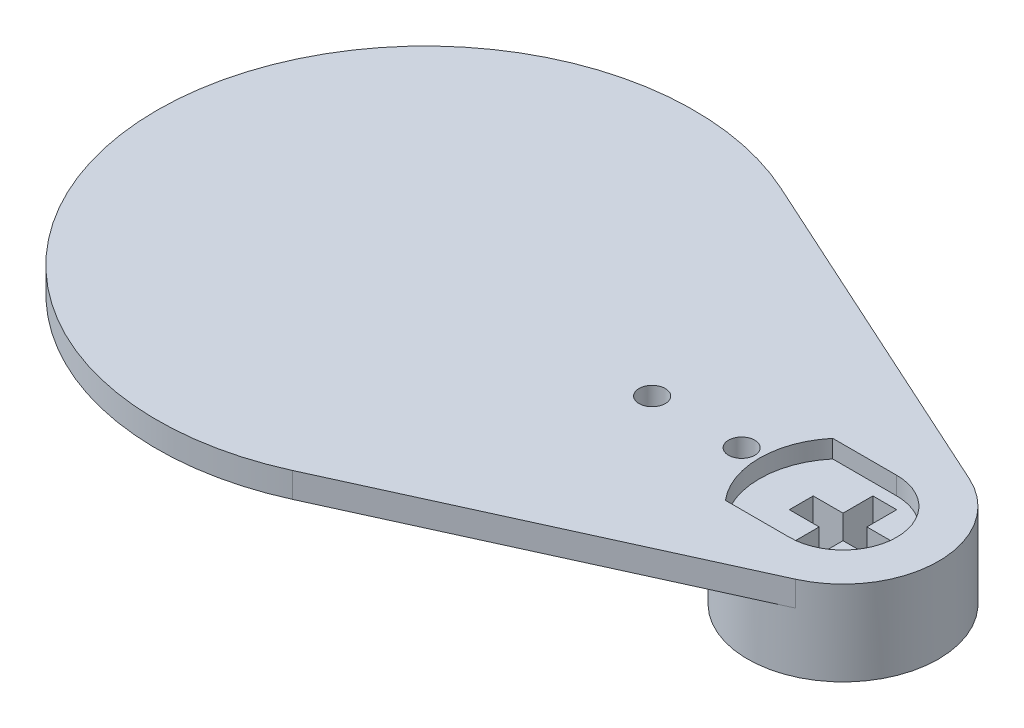
ISO-10303-21;
HEADER;
FILE_DESCRIPTION(('STEP AP214'),'2;1');
FILE_NAME('part.step','',(''),(''),'','','');
FILE_SCHEMA(('AUTOMOTIVE_DESIGN { 1 0 10303 214 1 1 1 1 }'));
ENDSEC;
DATA;
#1=APPLICATION_CONTEXT('core data for automotive mechanical design processes');
#2=APPLICATION_PROTOCOL_DEFINITION('international standard','automotive_design',2000,#1);
#3=PRODUCT_CONTEXT('',#1,'mechanical');
#4=PRODUCT('Part','Part','',(#3));
#5=PRODUCT_RELATED_PRODUCT_CATEGORY('part','',(#4));
#6=PRODUCT_DEFINITION_FORMATION('','',#4);
#7=PRODUCT_DEFINITION_CONTEXT('part definition',#1,'design');
#8=PRODUCT_DEFINITION('design','',#6,#7);
#9=PRODUCT_DEFINITION_SHAPE('','',#8);
#10=(LENGTH_UNIT() NAMED_UNIT(*) SI_UNIT(.MILLI.,.METRE.));
#11=(NAMED_UNIT(*) PLANE_ANGLE_UNIT() SI_UNIT($,.RADIAN.));
#12=(NAMED_UNIT(*) SI_UNIT($,.STERADIAN.) SOLID_ANGLE_UNIT());
#13=UNCERTAINTY_MEASURE_WITH_UNIT(LENGTH_MEASURE(1.E-05),#10,'distance_accuracy_value','');
#14=(GEOMETRIC_REPRESENTATION_CONTEXT(3) GLOBAL_UNCERTAINTY_ASSIGNED_CONTEXT((#13)) GLOBAL_UNIT_ASSIGNED_CONTEXT((#10,
#11,#12)) REPRESENTATION_CONTEXT('',''));
#15=CARTESIAN_POINT('',(0.,0.,0.));
#16=DIRECTION('',(0.,0.,1.));
#17=DIRECTION('',(1.,0.,0.));
#18=AXIS2_PLACEMENT_3D('',#15,#16,#17);
#19=CARTESIAN_POINT('',(-35.,2.1,0.));
#20=DIRECTION('',(0.,1.,0.));
#21=DIRECTION('',(0.,0.,1.));
#22=AXIS2_PLACEMENT_3D('',#19,#20,#21);
#23=PLANE('',#22);
#24=CARTESIAN_POINT('',(-8.5,2.1,0.));
#25=DIRECTION('',(0.,1.,0.));
#26=DIRECTION('',(0.,0.,1.));
#27=AXIS2_PLACEMENT_3D('',#24,#25,#26);
#28=CIRCLE('',#27,1.1);
#29=CARTESIAN_POINT('',(-8.5,2.1,1.1));
#30=VERTEX_POINT('',#29);
#31=EDGE_CURVE('E292',#30,#30,#28,.T.);
#32=ORIENTED_EDGE('',*,*,#31,.F.);
#33=EDGE_LOOP('',(#32));
#34=FACE_BOUND('',#33,.T.);
#35=CARTESIAN_POINT('',(-16.,2.1,0.));
#36=DIRECTION('',(0.,1.,0.));
#37=DIRECTION('',(0.,0.,1.));
#38=AXIS2_PLACEMENT_3D('',#35,#36,#37);
#39=CIRCLE('',#38,1.1);
#40=CARTESIAN_POINT('',(-16.,2.1,1.1));
#41=VERTEX_POINT('',#40);
#42=EDGE_CURVE('E197',#41,#41,#39,.T.);
#43=ORIENTED_EDGE('',*,*,#42,.F.);
#44=EDGE_LOOP('',(#43));
#45=FACE_BOUND('',#44,.T.);
#46=CARTESIAN_POINT('',(0.,2.1,0.));
#47=DIRECTION('',(0.,1.,0.));
#48=DIRECTION('',(0.,0.,1.));
#49=AXIS2_PLACEMENT_3D('',#46,#47,#48);
#50=CIRCLE('',#49,7.);
#51=CARTESIAN_POINT('',(-5.3619026473818,2.1,-4.5));
#52=VERTEX_POINT('',#51);
#53=CARTESIAN_POINT('',(-5.3619026473818,2.1,4.5));
#54=VERTEX_POINT('',#53);
#55=EDGE_CURVE('E207',#52,#54,#50,.T.);
#56=ORIENTED_EDGE('',*,*,#55,.F.);
#57=DIRECTION('',(-1.,0.,0.));
#58=VECTOR('',#57,1.);
#59=CARTESIAN_POINT('',(-5.3619026473818,2.1,-4.5));
#60=LINE('',#59,#58);
#61=CARTESIAN_POINT('',(0.,2.1,-4.5));
#62=VERTEX_POINT('',#61);
#63=EDGE_CURVE('E220',#62,#52,#60,.T.);
#64=ORIENTED_EDGE('',*,*,#63,.F.);
#65=CARTESIAN_POINT('',(0.,2.1,0.));
#66=DIRECTION('',(0.,1.,0.));
#67=DIRECTION('',(0.,0.,1.));
#68=AXIS2_PLACEMENT_3D('',#65,#66,#67);
#69=CIRCLE('',#68,4.5);
#70=CARTESIAN_POINT('',(0.,2.1,4.5));
#71=VERTEX_POINT('',#70);
#72=EDGE_CURVE('E232',#71,#62,#69,.T.);
#73=ORIENTED_EDGE('',*,*,#72,.F.);
#74=DIRECTION('',(1.,0.,0.));
#75=VECTOR('',#74,1.);
#76=CARTESIAN_POINT('',(-5.3619026473818,2.1,4.5));
#77=LINE('',#76,#75);
#78=EDGE_CURVE('E210',#54,#71,#77,.T.);
#79=ORIENTED_EDGE('',*,*,#78,.F.);
#80=EDGE_LOOP('',(#56,#64,#73,#79));
#81=FACE_BOUND('',#80,.T.);
#82=CARTESIAN_POINT('',(-35.,2.1,0.));
#83=DIRECTION('',(0.,1.,0.));
#84=DIRECTION('',(0.,0.,1.));
#85=AXIS2_PLACEMENT_3D('',#82,#83,#84);
#86=CIRCLE('',#85,22.5);
#87=CARTESIAN_POINT('',(-25.6785714285714,2.1,-20.4783048465383));
#88=VERTEX_POINT('',#87);
#89=CARTESIAN_POINT('',(-25.6785714285714,2.1,20.4783048465383));
#90=VERTEX_POINT('',#89);
#91=EDGE_CURVE('E246',#88,#90,#86,.T.);
#92=ORIENTED_EDGE('',*,*,#91,.T.);
#93=DIRECTION('',(0.91014688206837,0.,-0.414285714285714));
#94=VECTOR('',#93,1.);
#95=CARTESIAN_POINT('',(-25.6785714285714,2.1,20.4783048465383));
#96=LINE('',#95,#94);
#97=CARTESIAN_POINT('',(3.31428571428571,2.1,7.28117505654696));
#98=VERTEX_POINT('',#97);
#99=EDGE_CURVE('E249',#90,#98,#96,.T.);
#100=ORIENTED_EDGE('',*,*,#99,.T.);
#101=CARTESIAN_POINT('',(0.,2.1,0.));
#102=DIRECTION('',(0.,1.,0.));
#103=DIRECTION('',(0.,0.,1.));
#104=AXIS2_PLACEMENT_3D('',#101,#102,#103);
#105=CIRCLE('',#104,8.);
#106=CARTESIAN_POINT('',(3.31428571428571,2.1,-7.28117505654696));
#107=VERTEX_POINT('',#106);
#108=EDGE_CURVE('E252',#98,#107,#105,.T.);
#109=ORIENTED_EDGE('',*,*,#108,.T.);
#110=DIRECTION('',(-0.91014688206837,0.,-0.414285714285714));
#111=VECTOR('',#110,1.);
#112=CARTESIAN_POINT('',(-25.6785714285714,2.1,-20.4783048465383));
#113=LINE('',#112,#111);
#114=EDGE_CURVE('E254',#107,#88,#113,.T.);
#115=ORIENTED_EDGE('',*,*,#114,.T.);
#116=EDGE_LOOP('',(#92,#100,#109,#115));
#117=FACE_BOUND('',#116,.T.);
#118=ADVANCED_FACE('F36',(#34,#45,#81,#117),#23,.T.);
#119=CARTESIAN_POINT('',(-35.,0.,0.));
#120=DIRECTION('',(0.,1.,0.));
#121=DIRECTION('',(0.,0.,1.));
#122=AXIS2_PLACEMENT_3D('',#119,#120,#121);
#123=PLANE('',#122);
#124=CARTESIAN_POINT('',(-16.,0.,0.));
#125=DIRECTION('',(0.,1.,0.));
#126=DIRECTION('',(0.,0.,1.));
#127=AXIS2_PLACEMENT_3D('',#124,#125,#126);
#128=CIRCLE('',#127,1.1);
#129=CARTESIAN_POINT('',(-16.,0.,1.1));
#130=VERTEX_POINT('',#129);
#131=EDGE_CURVE('E40',#130,#130,#128,.T.);
#132=ORIENTED_EDGE('',*,*,#131,.T.);
#133=EDGE_LOOP('',(#132));
#134=FACE_BOUND('',#133,.T.);
#135=CARTESIAN_POINT('',(0.,0.,0.));
#136=DIRECTION('',(0.,-1.,0.));
#137=DIRECTION('',(0.,0.,-1.));
#138=AXIS2_PLACEMENT_3D('',#135,#136,#137);
#139=CIRCLE('',#138,8.);
#140=CARTESIAN_POINT('',(-7.64705882352941,0.,-2.34999815946331));
#141=VERTEX_POINT('',#140);
#142=CARTESIAN_POINT('',(3.31428571428571,0.,-7.28117505654696));
#143=VERTEX_POINT('',#142);
#144=EDGE_CURVE('E45',#141,#143,#139,.T.);
#145=ORIENTED_EDGE('',*,*,#144,.F.);
#146=CARTESIAN_POINT('',(-8.5,0.,0.));
#147=DIRECTION('',(0.,1.,0.));
#148=DIRECTION('',(0.,0.,1.));
#149=AXIS2_PLACEMENT_3D('',#146,#147,#148);
#150=CIRCLE('',#149,2.5);
#151=CARTESIAN_POINT('',(-7.64705882352941,0.,2.34999815946331));
#152=VERTEX_POINT('',#151);
#153=EDGE_CURVE('E193',#141,#152,#150,.F.);
#154=ORIENTED_EDGE('',*,*,#153,.T.);
#155=CARTESIAN_POINT('',(3.31428571428571,0.,7.28117505654696));
#156=VERTEX_POINT('',#155);
#157=EDGE_CURVE('E11',#156,#152,#139,.T.);
#158=ORIENTED_EDGE('',*,*,#157,.F.);
#159=DIRECTION('',(0.91014688206837,0.,-0.414285714285714));
#160=VECTOR('',#159,1.);
#161=CARTESIAN_POINT('',(-25.6785714285714,0.,20.4783048465383));
#162=LINE('',#161,#160);
#163=CARTESIAN_POINT('',(-25.6785714285714,0.,20.4783048465383));
#164=VERTEX_POINT('',#163);
#165=EDGE_CURVE('E259',#164,#156,#162,.T.);
#166=ORIENTED_EDGE('',*,*,#165,.F.);
#167=CARTESIAN_POINT('',(-35.,0.,0.));
#168=DIRECTION('',(0.,1.,0.));
#169=DIRECTION('',(0.,0.,1.));
#170=AXIS2_PLACEMENT_3D('',#167,#168,#169);
#171=CIRCLE('',#170,22.5);
#172=CARTESIAN_POINT('',(-25.6785714285714,0.,-20.4783048465383));
#173=VERTEX_POINT('',#172);
#174=EDGE_CURVE('E239',#173,#164,#171,.T.);
#175=ORIENTED_EDGE('',*,*,#174,.F.);
#176=DIRECTION('',(-0.91014688206837,0.,-0.414285714285714));
#177=VECTOR('',#176,1.);
#178=CARTESIAN_POINT('',(-25.6785714285714,0.,-20.4783048465383));
#179=LINE('',#178,#177);
#180=EDGE_CURVE('E250',#143,#173,#179,.T.);
#181=ORIENTED_EDGE('',*,*,#180,.F.);
#182=EDGE_LOOP('',(#145,#154,#158,#166,#175,#181));
#183=FACE_BOUND('',#182,.T.);
#184=CARTESIAN_POINT('',(-8.5,0.,0.));
#185=DIRECTION('',(0.,1.,0.));
#186=DIRECTION('',(0.,0.,1.));
#187=AXIS2_PLACEMENT_3D('',#184,#185,#186);
#188=CIRCLE('',#187,1.1);
#189=CARTESIAN_POINT('',(-8.5,0.,1.1));
#190=VERTEX_POINT('',#189);
#191=EDGE_CURVE('E295',#190,#190,#188,.T.);
#192=ORIENTED_EDGE('',*,*,#191,.T.);
#193=EDGE_LOOP('',(#192));
#194=FACE_BOUND('',#193,.T.);
#195=ADVANCED_FACE('F280',(#134,#183,#194),#123,.F.);
#196=CARTESIAN_POINT('',(-35.,2.1,0.));
#197=DIRECTION('',(0.,-1.,0.));
#198=DIRECTION('',(0.,0.,-1.));
#199=AXIS2_PLACEMENT_3D('',#196,#197,#198);
#200=CYLINDRICAL_SURFACE('',#199,22.5);
#201=ORIENTED_EDGE('',*,*,#174,.T.);
#202=DIRECTION('',(0.,-1.,0.));
#203=VECTOR('',#202,1.);
#204=CARTESIAN_POINT('',(-25.6785714285714,2.1,20.4783048465383));
#205=LINE('',#204,#203);
#206=EDGE_CURVE('E270',#90,#164,#205,.T.);
#207=ORIENTED_EDGE('',*,*,#206,.F.);
#208=ORIENTED_EDGE('',*,*,#91,.F.);
#209=DIRECTION('',(0.,-1.,0.));
#210=VECTOR('',#209,1.);
#211=CARTESIAN_POINT('',(-25.6785714285714,2.1,-20.4783048465383));
#212=LINE('',#211,#210);
#213=EDGE_CURVE('E256',#88,#173,#212,.T.);
#214=ORIENTED_EDGE('',*,*,#213,.T.);
#215=EDGE_LOOP('',(#201,#207,#208,#214));
#216=FACE_BOUND('',#215,.T.);
#217=ADVANCED_FACE('F38',(#216),#200,.T.);
#218=CARTESIAN_POINT('',(-25.6785714285714,2.1,20.4783048465383));
#219=DIRECTION('',(-0.414285714285714,0.,-0.91014688206837));
#220=DIRECTION('',(-0.91014688206837,0.,0.414285714285714));
#221=AXIS2_PLACEMENT_3D('',#218,#219,#220);
#222=PLANE('',#221);
#223=ORIENTED_EDGE('',*,*,#165,.T.);
#224=DIRECTION('',(0.,-1.,0.));
#225=VECTOR('',#224,1.);
#226=CARTESIAN_POINT('',(3.31428571428571,2.1,7.28117505654696));
#227=LINE('',#226,#225);
#228=EDGE_CURVE('E268',#98,#156,#227,.T.);
#229=ORIENTED_EDGE('',*,*,#228,.F.);
#230=ORIENTED_EDGE('',*,*,#99,.F.);
#231=ORIENTED_EDGE('',*,*,#206,.T.);
#232=EDGE_LOOP('',(#223,#229,#230,#231));
#233=FACE_BOUND('',#232,.T.);
#234=ADVANCED_FACE('F288',(#233),#222,.F.);
#235=CARTESIAN_POINT('',(0.,2.1,0.));
#236=DIRECTION('',(0.,-1.,0.));
#237=DIRECTION('',(0.,0.,-1.));
#238=AXIS2_PLACEMENT_3D('',#235,#236,#237);
#239=CYLINDRICAL_SURFACE('',#238,8.);
#240=CARTESIAN_POINT('',(0.,-5.,0.));
#241=DIRECTION('',(0.,-1.,0.));
#242=DIRECTION('',(0.,0.,-1.));
#243=AXIS2_PLACEMENT_3D('',#240,#241,#242);
#244=CIRCLE('',#243,8.);
#245=CARTESIAN_POINT('',(-7.64705882352941,-5.,-2.34999815946331));
#246=VERTEX_POINT('',#245);
#247=CARTESIAN_POINT('',(-7.64705882352941,-5.,2.34999815946331));
#248=VERTEX_POINT('',#247);
#249=EDGE_CURVE('E204',#246,#248,#244,.T.);
#250=ORIENTED_EDGE('',*,*,#249,.F.);
#251=DIRECTION('',(0.,-1.,0.));
#252=VECTOR('',#251,1.);
#253=CARTESIAN_POINT('',(-7.64705882352941,-2.5,-2.34999815946331));
#254=LINE('',#253,#252);
#255=EDGE_CURVE('E187',#246,#141,#254,.F.);
#256=ORIENTED_EDGE('',*,*,#255,.T.);
#257=ORIENTED_EDGE('',*,*,#144,.T.);
#258=DIRECTION('',(0.,-1.,0.));
#259=VECTOR('',#258,1.);
#260=CARTESIAN_POINT('',(3.31428571428571,2.1,-7.28117505654696));
#261=LINE('',#260,#259);
#262=EDGE_CURVE('E265',#107,#143,#261,.T.);
#263=ORIENTED_EDGE('',*,*,#262,.F.);
#264=ORIENTED_EDGE('',*,*,#108,.F.);
#265=ORIENTED_EDGE('',*,*,#228,.T.);
#266=ORIENTED_EDGE('',*,*,#157,.T.);
#267=DIRECTION('',(0.,-1.,0.));
#268=VECTOR('',#267,1.);
#269=CARTESIAN_POINT('',(-7.64705882352941,-2.5,2.34999815946331));
#270=LINE('',#269,#268);
#271=EDGE_CURVE('E198',#152,#248,#270,.T.);
#272=ORIENTED_EDGE('',*,*,#271,.T.);
#273=EDGE_LOOP('',(#250,#256,#257,#263,#264,#265,#266,#272));
#274=FACE_BOUND('',#273,.T.);
#275=ADVANCED_FACE('F206',(#274),#239,.T.);
#276=CARTESIAN_POINT('',(-25.6785714285714,2.1,-20.4783048465383));
#277=DIRECTION('',(-0.414285714285714,0.,0.91014688206837));
#278=DIRECTION('',(0.91014688206837,0.,0.414285714285714));
#279=AXIS2_PLACEMENT_3D('',#276,#277,#278);
#280=PLANE('',#279);
#281=ORIENTED_EDGE('',*,*,#180,.T.);
#282=ORIENTED_EDGE('',*,*,#213,.F.);
#283=ORIENTED_EDGE('',*,*,#114,.F.);
#284=ORIENTED_EDGE('',*,*,#262,.T.);
#285=EDGE_LOOP('',(#281,#282,#283,#284));
#286=FACE_BOUND('',#285,.T.);
#287=ADVANCED_FACE('F284',(#286),#280,.F.);
#288=CARTESIAN_POINT('',(0.,0.6,0.));
#289=DIRECTION('',(0.,1.,0.));
#290=DIRECTION('',(0.,0.,1.));
#291=AXIS2_PLACEMENT_3D('',#288,#289,#290);
#292=CYLINDRICAL_SURFACE('',#291,7.);
#293=ORIENTED_EDGE('',*,*,#55,.T.);
#294=DIRECTION('',(0.,1.,0.));
#295=VECTOR('',#294,1.);
#296=CARTESIAN_POINT('',(-5.3619026473818,0.6,4.5));
#297=LINE('',#296,#295);
#298=CARTESIAN_POINT('',(-5.3619026473818,0.6,4.5));
#299=VERTEX_POINT('',#298);
#300=EDGE_CURVE('E228',#299,#54,#297,.T.);
#301=ORIENTED_EDGE('',*,*,#300,.F.);
#302=CARTESIAN_POINT('',(0.,0.6,0.));
#303=DIRECTION('',(0.,1.,0.));
#304=DIRECTION('',(0.,0.,1.));
#305=AXIS2_PLACEMENT_3D('',#302,#303,#304);
#306=CIRCLE('',#305,7.);
#307=CARTESIAN_POINT('',(-5.3619026473818,0.6,-4.5));
#308=VERTEX_POINT('',#307);
#309=EDGE_CURVE('E216',#308,#299,#306,.T.);
#310=ORIENTED_EDGE('',*,*,#309,.F.);
#311=DIRECTION('',(0.,1.,0.));
#312=VECTOR('',#311,1.);
#313=CARTESIAN_POINT('',(-5.3619026473818,0.6,-4.5));
#314=LINE('',#313,#312);
#315=EDGE_CURVE('E237',#308,#52,#314,.T.);
#316=ORIENTED_EDGE('',*,*,#315,.T.);
#317=EDGE_LOOP('',(#293,#301,#310,#316));
#318=FACE_BOUND('',#317,.T.);
#319=ADVANCED_FACE('F452',(#318),#292,.F.);
#320=CARTESIAN_POINT('',(-5.3619026473818,0.6,-4.5));
#321=DIRECTION('',(0.,0.,-1.));
#322=DIRECTION('',(-1.,0.,0.));
#323=AXIS2_PLACEMENT_3D('',#320,#321,#322);
#324=PLANE('',#323);
#325=ORIENTED_EDGE('',*,*,#63,.T.);
#326=ORIENTED_EDGE('',*,*,#315,.F.);
#327=DIRECTION('',(-1.,0.,0.));
#328=VECTOR('',#327,1.);
#329=CARTESIAN_POINT('',(-5.3619026473818,0.6,-4.5));
#330=LINE('',#329,#328);
#331=CARTESIAN_POINT('',(0.,0.6,-4.5));
#332=VERTEX_POINT('',#331);
#333=EDGE_CURVE('E226',#332,#308,#330,.T.);
#334=ORIENTED_EDGE('',*,*,#333,.F.);
#335=DIRECTION('',(0.,1.,0.));
#336=VECTOR('',#335,1.);
#337=CARTESIAN_POINT('',(0.,0.6,-4.5));
#338=LINE('',#337,#336);
#339=EDGE_CURVE('E240',#332,#62,#338,.T.);
#340=ORIENTED_EDGE('',*,*,#339,.T.);
#341=EDGE_LOOP('',(#325,#326,#334,#340));
#342=FACE_BOUND('',#341,.T.);
#343=ADVANCED_FACE('F615',(#342),#324,.F.);
#344=CARTESIAN_POINT('',(0.,0.6,0.));
#345=DIRECTION('',(0.,1.,0.));
#346=DIRECTION('',(0.,0.,1.));
#347=AXIS2_PLACEMENT_3D('',#344,#345,#346);
#348=CYLINDRICAL_SURFACE('',#347,4.5);
#349=ORIENTED_EDGE('',*,*,#72,.T.);
#350=ORIENTED_EDGE('',*,*,#339,.F.);
#351=CARTESIAN_POINT('',(0.,0.6,0.));
#352=DIRECTION('',(0.,1.,0.));
#353=DIRECTION('',(0.,0.,1.));
#354=AXIS2_PLACEMENT_3D('',#351,#352,#353);
#355=CIRCLE('',#354,4.5);
#356=CARTESIAN_POINT('',(0.,0.6,4.5));
#357=VERTEX_POINT('',#356);
#358=EDGE_CURVE('E223',#357,#332,#355,.T.);
#359=ORIENTED_EDGE('',*,*,#358,.F.);
#360=DIRECTION('',(0.,1.,0.));
#361=VECTOR('',#360,1.);
#362=CARTESIAN_POINT('',(0.,0.6,4.5));
#363=LINE('',#362,#361);
#364=EDGE_CURVE('E242',#357,#71,#363,.T.);
#365=ORIENTED_EDGE('',*,*,#364,.T.);
#366=EDGE_LOOP('',(#349,#350,#359,#365));
#367=FACE_BOUND('',#366,.T.);
#368=ADVANCED_FACE('F623',(#367),#348,.F.);
#369=CARTESIAN_POINT('',(-5.3619026473818,0.6,4.5));
#370=DIRECTION('',(0.,0.,1.));
#371=DIRECTION('',(1.,0.,0.));
#372=AXIS2_PLACEMENT_3D('',#369,#370,#371);
#373=PLANE('',#372);
#374=ORIENTED_EDGE('',*,*,#78,.T.);
#375=ORIENTED_EDGE('',*,*,#364,.F.);
#376=DIRECTION('',(1.,0.,0.));
#377=VECTOR('',#376,1.);
#378=CARTESIAN_POINT('',(-5.3619026473818,0.6,4.5));
#379=LINE('',#378,#377);
#380=EDGE_CURVE('E219',#299,#357,#379,.T.);
#381=ORIENTED_EDGE('',*,*,#380,.F.);
#382=ORIENTED_EDGE('',*,*,#300,.T.);
#383=EDGE_LOOP('',(#374,#375,#381,#382));
#384=FACE_BOUND('',#383,.T.);
#385=ADVANCED_FACE('F632',(#384),#373,.F.);
#386=CARTESIAN_POINT('',(0.,0.6,0.));
#387=DIRECTION('',(0.,1.,0.));
#388=DIRECTION('',(0.,0.,1.));
#389=AXIS2_PLACEMENT_3D('',#386,#387,#388);
#390=PLANE('',#389);
#391=DIRECTION('',(-1.,0.,0.));
#392=VECTOR('',#391,1.);
#393=CARTESIAN_POINT('',(0.,0.6,-3.5));
#394=LINE('',#393,#392);
#395=CARTESIAN_POINT('',(1.,0.6,-3.5));
#396=VERTEX_POINT('',#395);
#397=CARTESIAN_POINT('',(-1.,0.6,-3.5));
#398=VERTEX_POINT('',#397);
#399=EDGE_CURVE('E208',#396,#398,#394,.T.);
#400=ORIENTED_EDGE('',*,*,#399,.F.);
#401=DIRECTION('',(0.,0.,-1.));
#402=VECTOR('',#401,1.);
#403=CARTESIAN_POINT('',(1.,0.6,0.));
#404=LINE('',#403,#402);
#405=CARTESIAN_POINT('',(1.,0.6,-1.));
#406=VERTEX_POINT('',#405);
#407=EDGE_CURVE('E336',#406,#396,#404,.T.);
#408=ORIENTED_EDGE('',*,*,#407,.F.);
#409=DIRECTION('',(-1.,0.,0.));
#410=VECTOR('',#409,1.);
#411=CARTESIAN_POINT('',(0.,0.6,-1.));
#412=LINE('',#411,#410);
#413=CARTESIAN_POINT('',(3.5,0.6,-1.));
#414=VERTEX_POINT('',#413);
#415=EDGE_CURVE('E358',#414,#406,#412,.T.);
#416=ORIENTED_EDGE('',*,*,#415,.F.);
#417=DIRECTION('',(0.,0.,-1.));
#418=VECTOR('',#417,1.);
#419=CARTESIAN_POINT('',(3.5,0.6,0.));
#420=LINE('',#419,#418);
#421=CARTESIAN_POINT('',(3.5,0.6,1.));
#422=VERTEX_POINT('',#421);
#423=EDGE_CURVE('E360',#422,#414,#420,.T.);
#424=ORIENTED_EDGE('',*,*,#423,.F.);
#425=DIRECTION('',(1.,0.,0.));
#426=VECTOR('',#425,1.);
#427=CARTESIAN_POINT('',(0.,0.6,1.));
#428=LINE('',#427,#426);
#429=CARTESIAN_POINT('',(1.,0.6,1.));
#430=VERTEX_POINT('',#429);
#431=EDGE_CURVE('E362',#430,#422,#428,.T.);
#432=ORIENTED_EDGE('',*,*,#431,.F.);
#433=DIRECTION('',(0.,0.,-1.));
#434=VECTOR('',#433,1.);
#435=CARTESIAN_POINT('',(1.,0.6,0.));
#436=LINE('',#435,#434);
#437=CARTESIAN_POINT('',(1.,0.6,3.5));
#438=VERTEX_POINT('',#437);
#439=EDGE_CURVE('E364',#438,#430,#436,.T.);
#440=ORIENTED_EDGE('',*,*,#439,.F.);
#441=DIRECTION('',(1.,0.,0.));
#442=VECTOR('',#441,1.);
#443=CARTESIAN_POINT('',(0.,0.6,3.5));
#444=LINE('',#443,#442);
#445=CARTESIAN_POINT('',(-1.,0.6,3.5));
#446=VERTEX_POINT('',#445);
#447=EDGE_CURVE('E366',#446,#438,#444,.T.);
#448=ORIENTED_EDGE('',*,*,#447,.F.);
#449=DIRECTION('',(0.,0.,1.));
#450=VECTOR('',#449,1.);
#451=CARTESIAN_POINT('',(-1.,0.6,0.));
#452=LINE('',#451,#450);
#453=CARTESIAN_POINT('',(-1.,0.6,1.));
#454=VERTEX_POINT('',#453);
#455=EDGE_CURVE('E368',#454,#446,#452,.T.);
#456=ORIENTED_EDGE('',*,*,#455,.F.);
#457=DIRECTION('',(1.,0.,0.));
#458=VECTOR('',#457,1.);
#459=CARTESIAN_POINT('',(0.,0.6,1.));
#460=LINE('',#459,#458);
#461=CARTESIAN_POINT('',(-3.5,0.6,1.));
#462=VERTEX_POINT('',#461);
#463=EDGE_CURVE('E370',#462,#454,#460,.T.);
#464=ORIENTED_EDGE('',*,*,#463,.F.);
#465=DIRECTION('',(0.,0.,1.));
#466=VECTOR('',#465,1.);
#467=CARTESIAN_POINT('',(-3.5,0.6,0.));
#468=LINE('',#467,#466);
#469=CARTESIAN_POINT('',(-3.5,0.6,-1.));
#470=VERTEX_POINT('',#469);
#471=EDGE_CURVE('E372',#470,#462,#468,.T.);
#472=ORIENTED_EDGE('',*,*,#471,.F.);
#473=DIRECTION('',(-1.,0.,0.));
#474=VECTOR('',#473,1.);
#475=CARTESIAN_POINT('',(0.,0.6,-1.));
#476=LINE('',#475,#474);
#477=CARTESIAN_POINT('',(-1.,0.6,-1.));
#478=VERTEX_POINT('',#477);
#479=EDGE_CURVE('E374',#478,#470,#476,.T.);
#480=ORIENTED_EDGE('',*,*,#479,.F.);
#481=DIRECTION('',(0.,0.,1.));
#482=VECTOR('',#481,1.);
#483=CARTESIAN_POINT('',(-1.,0.6,0.));
#484=LINE('',#483,#482);
#485=EDGE_CURVE('E212',#398,#478,#484,.T.);
#486=ORIENTED_EDGE('',*,*,#485,.F.);
#487=EDGE_LOOP('',(#400,#408,#416,#424,#432,#440,#448,#456,#464,#472,#480,#486));
#488=FACE_BOUND('',#487,.T.);
#489=ORIENTED_EDGE('',*,*,#309,.T.);
#490=ORIENTED_EDGE('',*,*,#380,.T.);
#491=ORIENTED_EDGE('',*,*,#358,.T.);
#492=ORIENTED_EDGE('',*,*,#333,.T.);
#493=EDGE_LOOP('',(#489,#490,#491,#492));
#494=FACE_BOUND('',#493,.T.);
#495=ADVANCED_FACE('F389',(#488,#494),#390,.T.);
#496=CARTESIAN_POINT('',(0.,-5.,0.));
#497=DIRECTION('',(0.,-1.,0.));
#498=DIRECTION('',(0.,0.,-1.));
#499=AXIS2_PLACEMENT_3D('',#496,#497,#498);
#500=PLANE('',#499);
#501=CARTESIAN_POINT('',(-8.5,-5.,0.));
#502=DIRECTION('',(0.,-1.,0.));
#503=DIRECTION('',(0.,0.,-1.));
#504=AXIS2_PLACEMENT_3D('',#501,#502,#503);
#505=CIRCLE('',#504,2.5);
#506=EDGE_CURVE('E190',#246,#248,#505,.T.);
#507=ORIENTED_EDGE('',*,*,#506,.F.);
#508=ORIENTED_EDGE('',*,*,#249,.T.);
#509=EDGE_LOOP('',(#507,#508));
#510=FACE_BOUND('',#509,.T.);
#511=DIRECTION('',(1.,0.,0.));
#512=VECTOR('',#511,1.);
#513=CARTESIAN_POINT('',(-1.,-5.,-3.5));
#514=LINE('',#513,#512);
#515=CARTESIAN_POINT('',(-1.,-5.,-3.5));
#516=VERTEX_POINT('',#515);
#517=CARTESIAN_POINT('',(1.,-5.,-3.5));
#518=VERTEX_POINT('',#517);
#519=EDGE_CURVE('E61',#516,#518,#514,.T.);
#520=ORIENTED_EDGE('',*,*,#519,.F.);
#521=DIRECTION('',(0.,0.,-1.));
#522=VECTOR('',#521,1.);
#523=CARTESIAN_POINT('',(-1.,-5.,-1.));
#524=LINE('',#523,#522);
#525=CARTESIAN_POINT('',(-1.,-5.,-1.));
#526=VERTEX_POINT('',#525);
#527=EDGE_CURVE('E330',#526,#516,#524,.T.);
#528=ORIENTED_EDGE('',*,*,#527,.F.);
#529=DIRECTION('',(1.,0.,0.));
#530=VECTOR('',#529,1.);
#531=CARTESIAN_POINT('',(-3.5,-5.,-1.));
#532=LINE('',#531,#530);
#533=CARTESIAN_POINT('',(-3.5,-5.,-1.));
#534=VERTEX_POINT('',#533);
#535=EDGE_CURVE('E327',#534,#526,#532,.T.);
#536=ORIENTED_EDGE('',*,*,#535,.F.);
#537=DIRECTION('',(0.,0.,-1.));
#538=VECTOR('',#537,1.);
#539=CARTESIAN_POINT('',(-3.5,-5.,1.));
#540=LINE('',#539,#538);
#541=CARTESIAN_POINT('',(-3.5,-5.,1.));
#542=VERTEX_POINT('',#541);
#543=EDGE_CURVE('E324',#542,#534,#540,.T.);
#544=ORIENTED_EDGE('',*,*,#543,.F.);
#545=DIRECTION('',(-1.,0.,0.));
#546=VECTOR('',#545,1.);
#547=CARTESIAN_POINT('',(-3.5,-5.,1.));
#548=LINE('',#547,#546);
#549=CARTESIAN_POINT('',(-1.,-5.,1.));
#550=VERTEX_POINT('',#549);
#551=EDGE_CURVE('E321',#550,#542,#548,.T.);
#552=ORIENTED_EDGE('',*,*,#551,.F.);
#553=DIRECTION('',(0.,0.,-1.));
#554=VECTOR('',#553,1.);
#555=CARTESIAN_POINT('',(-1.,-5.,3.5));
#556=LINE('',#555,#554);
#557=CARTESIAN_POINT('',(-1.,-5.,3.5));
#558=VERTEX_POINT('',#557);
#559=EDGE_CURVE('E318',#558,#550,#556,.T.);
#560=ORIENTED_EDGE('',*,*,#559,.F.);
#561=DIRECTION('',(-1.,0.,0.));
#562=VECTOR('',#561,1.);
#563=CARTESIAN_POINT('',(-1.,-5.,3.5));
#564=LINE('',#563,#562);
#565=CARTESIAN_POINT('',(1.,-5.,3.5));
#566=VERTEX_POINT('',#565);
#567=EDGE_CURVE('E315',#566,#558,#564,.T.);
#568=ORIENTED_EDGE('',*,*,#567,.F.);
#569=DIRECTION('',(0.,0.,1.));
#570=VECTOR('',#569,1.);
#571=CARTESIAN_POINT('',(1.,-5.,3.5));
#572=LINE('',#571,#570);
#573=CARTESIAN_POINT('',(1.,-5.,1.));
#574=VERTEX_POINT('',#573);
#575=EDGE_CURVE('E312',#574,#566,#572,.T.);
#576=ORIENTED_EDGE('',*,*,#575,.F.);
#577=DIRECTION('',(-1.,0.,0.));
#578=VECTOR('',#577,1.);
#579=CARTESIAN_POINT('',(1.,-5.,1.));
#580=LINE('',#579,#578);
#581=CARTESIAN_POINT('',(3.5,-5.,1.));
#582=VERTEX_POINT('',#581);
#583=EDGE_CURVE('E309',#582,#574,#580,.T.);
#584=ORIENTED_EDGE('',*,*,#583,.F.);
#585=DIRECTION('',(0.,0.,1.));
#586=VECTOR('',#585,1.);
#587=CARTESIAN_POINT('',(3.5,-5.,1.));
#588=LINE('',#587,#586);
#589=CARTESIAN_POINT('',(3.5,-5.,-1.));
#590=VERTEX_POINT('',#589);
#591=EDGE_CURVE('E306',#590,#582,#588,.T.);
#592=ORIENTED_EDGE('',*,*,#591,.F.);
#593=DIRECTION('',(1.,0.,0.));
#594=VECTOR('',#593,1.);
#595=CARTESIAN_POINT('',(1.,-5.,-1.));
#596=LINE('',#595,#594);
#597=CARTESIAN_POINT('',(1.,-5.,-1.));
#598=VERTEX_POINT('',#597);
#599=EDGE_CURVE('E303',#598,#590,#596,.T.);
#600=ORIENTED_EDGE('',*,*,#599,.F.);
#601=DIRECTION('',(0.,0.,1.));
#602=VECTOR('',#601,1.);
#603=CARTESIAN_POINT('',(1.,-5.,-1.));
#604=LINE('',#603,#602);
#605=EDGE_CURVE('E301',#518,#598,#604,.T.);
#606=ORIENTED_EDGE('',*,*,#605,.F.);
#607=EDGE_LOOP('',(#520,#528,#536,#544,#552,#560,#568,#576,#584,#592,#600,#606));
#608=FACE_BOUND('',#607,.T.);
#609=ADVANCED_FACE('F202',(#510,#608),#500,.T.);
#610=CARTESIAN_POINT('',(-1.,2.1,-3.5));
#611=DIRECTION('',(0.,0.,-1.));
#612=DIRECTION('',(-1.,0.,0.));
#613=AXIS2_PLACEMENT_3D('',#610,#611,#612);
#614=PLANE('',#613);
#615=ORIENTED_EDGE('',*,*,#399,.T.);
#616=DIRECTION('',(0.,-1.,0.));
#617=VECTOR('',#616,1.);
#618=CARTESIAN_POINT('',(-1.,2.1,-3.5));
#619=LINE('',#618,#617);
#620=EDGE_CURVE('E334',#398,#516,#619,.T.);
#621=ORIENTED_EDGE('',*,*,#620,.T.);
#622=ORIENTED_EDGE('',*,*,#519,.T.);
#623=DIRECTION('',(0.,-1.,0.));
#624=VECTOR('',#623,1.);
#625=CARTESIAN_POINT('',(1.,2.1,-3.5));
#626=LINE('',#625,#624);
#627=EDGE_CURVE('E333',#396,#518,#626,.T.);
#628=ORIENTED_EDGE('',*,*,#627,.F.);
#629=EDGE_LOOP('',(#615,#621,#622,#628));
#630=FACE_BOUND('',#629,.T.);
#631=ADVANCED_FACE('F407',(#630),#614,.F.);
#632=CARTESIAN_POINT('',(-1.,2.1,-1.));
#633=DIRECTION('',(-1.,0.,0.));
#634=DIRECTION('',(0.,0.,1.));
#635=AXIS2_PLACEMENT_3D('',#632,#633,#634);
#636=PLANE('',#635);
#637=ORIENTED_EDGE('',*,*,#485,.T.);
#638=DIRECTION('',(0.,-1.,0.));
#639=VECTOR('',#638,1.);
#640=CARTESIAN_POINT('',(-1.,2.1,-1.));
#641=LINE('',#640,#639);
#642=EDGE_CURVE('E337',#478,#526,#641,.T.);
#643=ORIENTED_EDGE('',*,*,#642,.T.);
#644=ORIENTED_EDGE('',*,*,#527,.T.);
#645=ORIENTED_EDGE('',*,*,#620,.F.);
#646=EDGE_LOOP('',(#637,#643,#644,#645));
#647=FACE_BOUND('',#646,.T.);
#648=ADVANCED_FACE('F379',(#647),#636,.F.);
#649=CARTESIAN_POINT('',(-3.5,2.1,-1.));
#650=DIRECTION('',(0.,0.,-1.));
#651=DIRECTION('',(-1.,0.,0.));
#652=AXIS2_PLACEMENT_3D('',#649,#650,#651);
#653=PLANE('',#652);
#654=ORIENTED_EDGE('',*,*,#479,.T.);
#655=DIRECTION('',(0.,-1.,0.));
#656=VECTOR('',#655,1.);
#657=CARTESIAN_POINT('',(-3.5,2.1,-1.));
#658=LINE('',#657,#656);
#659=EDGE_CURVE('E339',#470,#534,#658,.T.);
#660=ORIENTED_EDGE('',*,*,#659,.T.);
#661=ORIENTED_EDGE('',*,*,#535,.T.);
#662=ORIENTED_EDGE('',*,*,#642,.F.);
#663=EDGE_LOOP('',(#654,#660,#661,#662));
#664=FACE_BOUND('',#663,.T.);
#665=ADVANCED_FACE('F384',(#664),#653,.F.);
#666=CARTESIAN_POINT('',(-3.5,2.1,1.));
#667=DIRECTION('',(-1.,0.,0.));
#668=DIRECTION('',(0.,0.,1.));
#669=AXIS2_PLACEMENT_3D('',#666,#667,#668);
#670=PLANE('',#669);
#671=ORIENTED_EDGE('',*,*,#471,.T.);
#672=DIRECTION('',(0.,-1.,0.));
#673=VECTOR('',#672,1.);
#674=CARTESIAN_POINT('',(-3.5,2.1,1.));
#675=LINE('',#674,#673);
#676=EDGE_CURVE('E341',#462,#542,#675,.T.);
#677=ORIENTED_EDGE('',*,*,#676,.T.);
#678=ORIENTED_EDGE('',*,*,#543,.T.);
#679=ORIENTED_EDGE('',*,*,#659,.F.);
#680=EDGE_LOOP('',(#671,#677,#678,#679));
#681=FACE_BOUND('',#680,.T.);
#682=ADVANCED_FACE('F395',(#681),#670,.F.);
#683=CARTESIAN_POINT('',(-3.5,2.1,1.));
#684=DIRECTION('',(0.,0.,1.));
#685=DIRECTION('',(1.,0.,0.));
#686=AXIS2_PLACEMENT_3D('',#683,#684,#685);
#687=PLANE('',#686);
#688=ORIENTED_EDGE('',*,*,#463,.T.);
#689=DIRECTION('',(0.,-1.,0.));
#690=VECTOR('',#689,1.);
#691=CARTESIAN_POINT('',(-1.,2.1,1.));
#692=LINE('',#691,#690);
#693=EDGE_CURVE('E343',#454,#550,#692,.T.);
#694=ORIENTED_EDGE('',*,*,#693,.T.);
#695=ORIENTED_EDGE('',*,*,#551,.T.);
#696=ORIENTED_EDGE('',*,*,#676,.F.);
#697=EDGE_LOOP('',(#688,#694,#695,#696));
#698=FACE_BOUND('',#697,.T.);
#699=ADVANCED_FACE('F397',(#698),#687,.F.);
#700=CARTESIAN_POINT('',(-1.,2.1,3.5));
#701=DIRECTION('',(-1.,0.,0.));
#702=DIRECTION('',(0.,0.,1.));
#703=AXIS2_PLACEMENT_3D('',#700,#701,#702);
#704=PLANE('',#703);
#705=ORIENTED_EDGE('',*,*,#455,.T.);
#706=DIRECTION('',(0.,-1.,0.));
#707=VECTOR('',#706,1.);
#708=CARTESIAN_POINT('',(-1.,2.1,3.5));
#709=LINE('',#708,#707);
#710=EDGE_CURVE('E345',#446,#558,#709,.T.);
#711=ORIENTED_EDGE('',*,*,#710,.T.);
#712=ORIENTED_EDGE('',*,*,#559,.T.);
#713=ORIENTED_EDGE('',*,*,#693,.F.);
#714=EDGE_LOOP('',(#705,#711,#712,#713));
#715=FACE_BOUND('',#714,.T.);
#716=ADVANCED_FACE('F432',(#715),#704,.F.);
#717=CARTESIAN_POINT('',(-1.,2.1,3.5));
#718=DIRECTION('',(0.,0.,1.));
#719=DIRECTION('',(1.,0.,0.));
#720=AXIS2_PLACEMENT_3D('',#717,#718,#719);
#721=PLANE('',#720);
#722=ORIENTED_EDGE('',*,*,#447,.T.);
#723=DIRECTION('',(0.,-1.,0.));
#724=VECTOR('',#723,1.);
#725=CARTESIAN_POINT('',(1.,2.1,3.5));
#726=LINE('',#725,#724);
#727=EDGE_CURVE('E347',#438,#566,#726,.T.);
#728=ORIENTED_EDGE('',*,*,#727,.T.);
#729=ORIENTED_EDGE('',*,*,#567,.T.);
#730=ORIENTED_EDGE('',*,*,#710,.F.);
#731=EDGE_LOOP('',(#722,#728,#729,#730));
#732=FACE_BOUND('',#731,.T.);
#733=ADVANCED_FACE('F429',(#732),#721,.F.);
#734=CARTESIAN_POINT('',(1.,2.1,3.5));
#735=DIRECTION('',(1.,0.,0.));
#736=DIRECTION('',(0.,0.,-1.));
#737=AXIS2_PLACEMENT_3D('',#734,#735,#736);
#738=PLANE('',#737);
#739=ORIENTED_EDGE('',*,*,#439,.T.);
#740=DIRECTION('',(0.,-1.,0.));
#741=VECTOR('',#740,1.);
#742=CARTESIAN_POINT('',(1.,2.1,1.));
#743=LINE('',#742,#741);
#744=EDGE_CURVE('E349',#430,#574,#743,.T.);
#745=ORIENTED_EDGE('',*,*,#744,.T.);
#746=ORIENTED_EDGE('',*,*,#575,.T.);
#747=ORIENTED_EDGE('',*,*,#727,.F.);
#748=EDGE_LOOP('',(#739,#745,#746,#747));
#749=FACE_BOUND('',#748,.T.);
#750=ADVANCED_FACE('F426',(#749),#738,.F.);
#751=CARTESIAN_POINT('',(1.,2.1,1.));
#752=DIRECTION('',(0.,0.,1.));
#753=DIRECTION('',(1.,0.,0.));
#754=AXIS2_PLACEMENT_3D('',#751,#752,#753);
#755=PLANE('',#754);
#756=ORIENTED_EDGE('',*,*,#431,.T.);
#757=DIRECTION('',(0.,-1.,0.));
#758=VECTOR('',#757,1.);
#759=CARTESIAN_POINT('',(3.5,2.1,1.));
#760=LINE('',#759,#758);
#761=EDGE_CURVE('E351',#422,#582,#760,.T.);
#762=ORIENTED_EDGE('',*,*,#761,.T.);
#763=ORIENTED_EDGE('',*,*,#583,.T.);
#764=ORIENTED_EDGE('',*,*,#744,.F.);
#765=EDGE_LOOP('',(#756,#762,#763,#764));
#766=FACE_BOUND('',#765,.T.);
#767=ADVANCED_FACE('F419',(#766),#755,.F.);
#768=CARTESIAN_POINT('',(3.5,2.1,1.));
#769=DIRECTION('',(1.,0.,0.));
#770=DIRECTION('',(0.,0.,-1.));
#771=AXIS2_PLACEMENT_3D('',#768,#769,#770);
#772=PLANE('',#771);
#773=ORIENTED_EDGE('',*,*,#423,.T.);
#774=DIRECTION('',(0.,-1.,0.));
#775=VECTOR('',#774,1.);
#776=CARTESIAN_POINT('',(3.5,2.1,-1.));
#777=LINE('',#776,#775);
#778=EDGE_CURVE('E353',#414,#590,#777,.T.);
#779=ORIENTED_EDGE('',*,*,#778,.T.);
#780=ORIENTED_EDGE('',*,*,#591,.T.);
#781=ORIENTED_EDGE('',*,*,#761,.F.);
#782=EDGE_LOOP('',(#773,#779,#780,#781));
#783=FACE_BOUND('',#782,.T.);
#784=ADVANCED_FACE('F415',(#783),#772,.F.);
#785=CARTESIAN_POINT('',(1.,2.1,-1.));
#786=DIRECTION('',(0.,0.,-1.));
#787=DIRECTION('',(-1.,0.,0.));
#788=AXIS2_PLACEMENT_3D('',#785,#786,#787);
#789=PLANE('',#788);
#790=ORIENTED_EDGE('',*,*,#415,.T.);
#791=DIRECTION('',(0.,-1.,0.));
#792=VECTOR('',#791,1.);
#793=CARTESIAN_POINT('',(1.,2.1,-1.));
#794=LINE('',#793,#792);
#795=EDGE_CURVE('E53',#406,#598,#794,.T.);
#796=ORIENTED_EDGE('',*,*,#795,.T.);
#797=ORIENTED_EDGE('',*,*,#599,.T.);
#798=ORIENTED_EDGE('',*,*,#778,.F.);
#799=EDGE_LOOP('',(#790,#796,#797,#798));
#800=FACE_BOUND('',#799,.T.);
#801=ADVANCED_FACE('F413',(#800),#789,.F.);
#802=CARTESIAN_POINT('',(1.,2.1,-1.));
#803=DIRECTION('',(1.,0.,0.));
#804=DIRECTION('',(0.,0.,-1.));
#805=AXIS2_PLACEMENT_3D('',#802,#803,#804);
#806=PLANE('',#805);
#807=ORIENTED_EDGE('',*,*,#407,.T.);
#808=ORIENTED_EDGE('',*,*,#627,.T.);
#809=ORIENTED_EDGE('',*,*,#605,.T.);
#810=ORIENTED_EDGE('',*,*,#795,.F.);
#811=EDGE_LOOP('',(#807,#808,#809,#810));
#812=FACE_BOUND('',#811,.T.);
#813=ADVANCED_FACE('F405',(#812),#806,.F.);
#814=CARTESIAN_POINT('',(-8.5,-5.,0.));
#815=DIRECTION('',(0.,1.,0.));
#816=DIRECTION('',(0.,0.,1.));
#817=AXIS2_PLACEMENT_3D('',#814,#815,#816);
#818=CYLINDRICAL_SURFACE('',#817,1.1);
#819=ORIENTED_EDGE('',*,*,#31,.T.);
#820=EDGE_LOOP('',(#819));
#821=FACE_BOUND('',#820,.T.);
#822=ORIENTED_EDGE('',*,*,#191,.F.);
#823=EDGE_LOOP('',(#822));
#824=FACE_BOUND('',#823,.T.);
#825=ADVANCED_FACE('F501',(#821,#824),#818,.F.);
#826=CARTESIAN_POINT('',(-16.,-5.,0.));
#827=DIRECTION('',(0.,1.,0.));
#828=DIRECTION('',(0.,0.,1.));
#829=AXIS2_PLACEMENT_3D('',#826,#827,#828);
#830=CYLINDRICAL_SURFACE('',#829,1.1);
#831=ORIENTED_EDGE('',*,*,#42,.T.);
#832=EDGE_LOOP('',(#831));
#833=FACE_BOUND('',#832,.T.);
#834=ORIENTED_EDGE('',*,*,#131,.F.);
#835=EDGE_LOOP('',(#834));
#836=FACE_BOUND('',#835,.T.);
#837=ADVANCED_FACE('F479',(#833,#836),#830,.F.);
#838=CARTESIAN_POINT('',(-8.5,7.07106781186548,0.));
#839=DIRECTION('',(0.,-1.,0.));
#840=DIRECTION('',(0.,0.,-1.));
#841=AXIS2_PLACEMENT_3D('',#838,#839,#840);
#842=CYLINDRICAL_SURFACE('',#841,2.5);
#843=ORIENTED_EDGE('',*,*,#506,.T.);
#844=ORIENTED_EDGE('',*,*,#271,.F.);
#845=ORIENTED_EDGE('',*,*,#153,.F.);
#846=ORIENTED_EDGE('',*,*,#255,.F.);
#847=EDGE_LOOP('',(#843,#844,#845,#846));
#848=FACE_BOUND('',#847,.T.);
#849=ADVANCED_FACE('F189',(#848),#842,.F.);
#850=CLOSED_SHELL('',(#118,#195,#217,#234,#275,#287,#319,#343,#368,#385,#495,#609,#631,#648,
#665,#682,#699,#716,#733,#750,#767,#784,#801,#813,#825,#837,#849));
#851=MANIFOLD_SOLID_BREP('B2',#850);
#852=ADVANCED_BREP_SHAPE_REPRESENTATION('',(#18,#851),#14);
#853=SHAPE_DEFINITION_REPRESENTATION(#9,#852);
ENDSEC;
END-ISO-10303-21;
